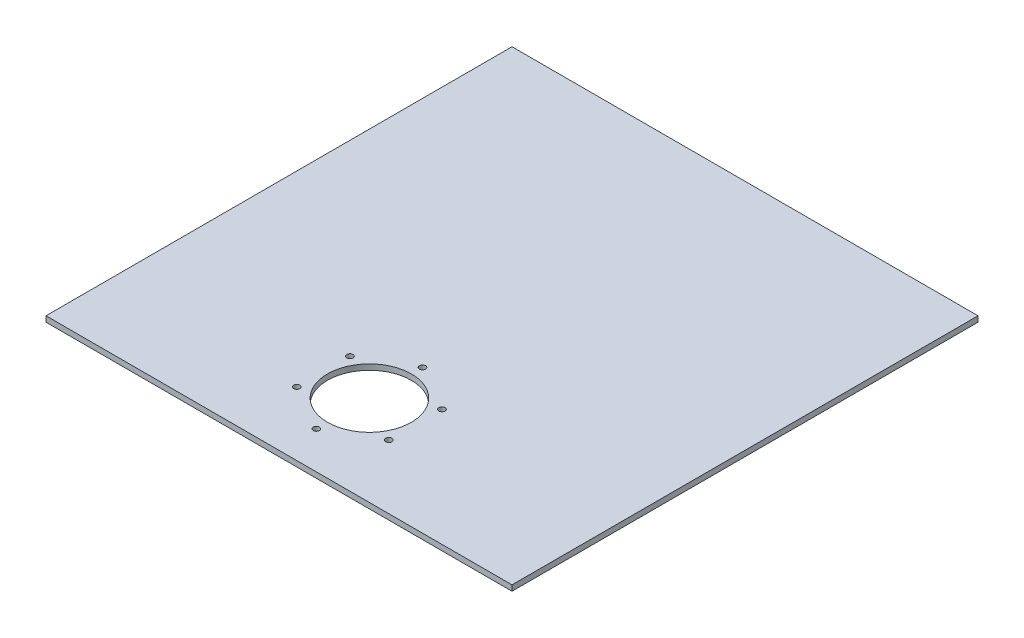
ISO-10303-21;
HEADER;
FILE_DESCRIPTION(('STEP AP214'),'2;1');
FILE_NAME('part.step','',(''),(''),'','','');
FILE_SCHEMA(('AUTOMOTIVE_DESIGN { 1 0 10303 214 1 1 1 1 }'));
ENDSEC;
DATA;
#1=APPLICATION_CONTEXT('core data for automotive mechanical design processes');
#2=APPLICATION_PROTOCOL_DEFINITION('international standard','automotive_design',2000,#1);
#3=PRODUCT_CONTEXT('',#1,'mechanical');
#4=PRODUCT('Part','Part','',(#3));
#5=PRODUCT_RELATED_PRODUCT_CATEGORY('part','',(#4));
#6=PRODUCT_DEFINITION_FORMATION('','',#4);
#7=PRODUCT_DEFINITION_CONTEXT('part definition',#1,'design');
#8=PRODUCT_DEFINITION('design','',#6,#7);
#9=PRODUCT_DEFINITION_SHAPE('','',#8);
#10=(LENGTH_UNIT() NAMED_UNIT(*) SI_UNIT(.MILLI.,.METRE.));
#11=(NAMED_UNIT(*) PLANE_ANGLE_UNIT() SI_UNIT($,.RADIAN.));
#12=(NAMED_UNIT(*) SI_UNIT($,.STERADIAN.) SOLID_ANGLE_UNIT());
#13=UNCERTAINTY_MEASURE_WITH_UNIT(LENGTH_MEASURE(1.E-05),#10,'distance_accuracy_value','');
#14=(GEOMETRIC_REPRESENTATION_CONTEXT(3) GLOBAL_UNCERTAINTY_ASSIGNED_CONTEXT((#13)) GLOBAL_UNIT_ASSIGNED_CONTEXT((#10,
#11,#12)) REPRESENTATION_CONTEXT('',''));
#15=CARTESIAN_POINT('',(0.,0.,0.));
#16=DIRECTION('',(0.,0.,1.));
#17=DIRECTION('',(1.,0.,0.));
#18=AXIS2_PLACEMENT_3D('',#15,#16,#17);
#19=CARTESIAN_POINT('',(0.,3.,0.));
#20=DIRECTION('',(0.,-1.,0.));
#21=DIRECTION('',(0.,0.,-1.));
#22=AXIS2_PLACEMENT_3D('',#19,#20,#21);
#23=PLANE('',#22);
#24=CARTESIAN_POINT('',(0.,3.,76.5));
#25=DIRECTION('',(0.,1.,0.));
#26=DIRECTION('',(0.,0.,1.));
#27=AXIS2_PLACEMENT_3D('',#24,#25,#26);
#28=CIRCLE('',#27,22.5);
#29=CARTESIAN_POINT('',(0.,3.,99.));
#30=VERTEX_POINT('',#29);
#31=EDGE_CURVE('E154',#30,#30,#28,.T.);
#32=ORIENTED_EDGE('',*,*,#31,.F.);
#33=EDGE_LOOP('',(#32));
#34=FACE_BOUND('',#33,.T.);
#35=CARTESIAN_POINT('',(-24.6817240078565,3.,90.7500000000001));
#36=DIRECTION('',(0.,1.,0.));
#37=DIRECTION('',(0.,0.,1.));
#38=AXIS2_PLACEMENT_3D('',#35,#36,#37);
#39=CIRCLE('',#38,1.65000000000001);
#40=CARTESIAN_POINT('',(-24.6817240078565,3.,92.4000000000001));
#41=VERTEX_POINT('',#40);
#42=EDGE_CURVE('E133',#41,#41,#39,.T.);
#43=ORIENTED_EDGE('',*,*,#42,.F.);
#44=EDGE_LOOP('',(#43));
#45=FACE_BOUND('',#44,.T.);
#46=DIRECTION('',(0.,0.,-1.));
#47=VECTOR('',#46,1.);
#48=CARTESIAN_POINT('',(125.,3.,125.));
#49=LINE('',#48,#47);
#50=CARTESIAN_POINT('',(125.,3.,125.));
#51=VERTEX_POINT('',#50);
#52=CARTESIAN_POINT('',(125.,3.,-125.));
#53=VERTEX_POINT('',#52);
#54=EDGE_CURVE('E92',#51,#53,#49,.T.);
#55=ORIENTED_EDGE('',*,*,#54,.T.);
#56=DIRECTION('',(-1.,0.,0.));
#57=VECTOR('',#56,1.);
#58=CARTESIAN_POINT('',(-125.,3.,-125.));
#59=LINE('',#58,#57);
#60=CARTESIAN_POINT('',(-125.,3.,-125.));
#61=VERTEX_POINT('',#60);
#62=EDGE_CURVE('E87',#53,#61,#59,.T.);
#63=ORIENTED_EDGE('',*,*,#62,.T.);
#64=DIRECTION('',(0.,0.,1.));
#65=VECTOR('',#64,1.);
#66=CARTESIAN_POINT('',(-125.,3.,125.));
#67=LINE('',#66,#65);
#68=CARTESIAN_POINT('',(-125.,3.,125.));
#69=VERTEX_POINT('',#68);
#70=EDGE_CURVE('E90',#61,#69,#67,.T.);
#71=ORIENTED_EDGE('',*,*,#70,.T.);
#72=DIRECTION('',(1.,0.,0.));
#73=VECTOR('',#72,1.);
#74=CARTESIAN_POINT('',(-125.,3.,125.));
#75=LINE('',#74,#73);
#76=EDGE_CURVE('E57',#69,#51,#75,.T.);
#77=ORIENTED_EDGE('',*,*,#76,.T.);
#78=EDGE_LOOP('',(#55,#63,#71,#77));
#79=FACE_BOUND('',#78,.T.);
#80=CARTESIAN_POINT('',(0.,3.,48.));
#81=DIRECTION('',(0.,1.,0.));
#82=DIRECTION('',(0.,0.,1.));
#83=AXIS2_PLACEMENT_3D('',#80,#81,#82);
#84=CIRCLE('',#83,1.65000000000001);
#85=CARTESIAN_POINT('',(0.,3.,49.65));
#86=VERTEX_POINT('',#85);
#87=EDGE_CURVE('E121',#86,#86,#84,.T.);
#88=ORIENTED_EDGE('',*,*,#87,.F.);
#89=EDGE_LOOP('',(#88));
#90=FACE_BOUND('',#89,.T.);
#91=CARTESIAN_POINT('',(-24.6817240078566,3.,62.2500000000001));
#92=DIRECTION('',(0.,1.,0.));
#93=DIRECTION('',(0.,0.,1.));
#94=AXIS2_PLACEMENT_3D('',#91,#92,#93);
#95=CIRCLE('',#94,1.65000000000001);
#96=CARTESIAN_POINT('',(-24.6817240078566,3.,63.9000000000001));
#97=VERTEX_POINT('',#96);
#98=EDGE_CURVE('E127',#97,#97,#95,.T.);
#99=ORIENTED_EDGE('',*,*,#98,.F.);
#100=EDGE_LOOP('',(#99));
#101=FACE_BOUND('',#100,.T.);
#102=CARTESIAN_POINT('',(0.,3.,105.));
#103=DIRECTION('',(0.,1.,0.));
#104=DIRECTION('',(0.,0.,1.));
#105=AXIS2_PLACEMENT_3D('',#102,#103,#104);
#106=CIRCLE('',#105,1.65000000000001);
#107=CARTESIAN_POINT('',(0.,3.,106.65));
#108=VERTEX_POINT('',#107);
#109=EDGE_CURVE('E139',#108,#108,#106,.T.);
#110=ORIENTED_EDGE('',*,*,#109,.F.);
#111=EDGE_LOOP('',(#110));
#112=FACE_BOUND('',#111,.T.);
#113=CARTESIAN_POINT('',(24.6817240078566,3.,90.7499999999998));
#114=DIRECTION('',(0.,1.,0.));
#115=DIRECTION('',(0.,0.,1.));
#116=AXIS2_PLACEMENT_3D('',#113,#114,#115);
#117=CIRCLE('',#116,1.65000000000001);
#118=CARTESIAN_POINT('',(24.6817240078566,3.,92.3999999999998));
#119=VERTEX_POINT('',#118);
#120=EDGE_CURVE('E145',#119,#119,#117,.T.);
#121=ORIENTED_EDGE('',*,*,#120,.F.);
#122=EDGE_LOOP('',(#121));
#123=FACE_BOUND('',#122,.T.);
#124=CARTESIAN_POINT('',(24.6817240078563,3.,62.2499999999997));
#125=DIRECTION('',(0.,1.,0.));
#126=DIRECTION('',(0.,0.,1.));
#127=AXIS2_PLACEMENT_3D('',#124,#125,#126);
#128=CIRCLE('',#127,1.65000000000001);
#129=CARTESIAN_POINT('',(24.6817240078563,3.,63.8999999999997));
#130=VERTEX_POINT('',#129);
#131=EDGE_CURVE('E151',#130,#130,#128,.T.);
#132=ORIENTED_EDGE('',*,*,#131,.F.);
#133=EDGE_LOOP('',(#132));
#134=FACE_BOUND('',#133,.T.);
#135=ADVANCED_FACE('F39',(#34,#45,#79,#90,#101,#112,#123,#134),#23,.F.);
#136=CARTESIAN_POINT('',(125.,3.,125.));
#137=DIRECTION('',(-1.,0.,0.));
#138=DIRECTION('',(0.,0.,1.));
#139=AXIS2_PLACEMENT_3D('',#136,#137,#138);
#140=PLANE('',#139);
#141=DIRECTION('',(0.,0.,-1.));
#142=VECTOR('',#141,1.);
#143=CARTESIAN_POINT('',(125.,0.,125.));
#144=LINE('',#143,#142);
#145=CARTESIAN_POINT('',(125.,0.,125.));
#146=VERTEX_POINT('',#145);
#147=CARTESIAN_POINT('',(125.,0.,-125.));
#148=VERTEX_POINT('',#147);
#149=EDGE_CURVE('E105',#146,#148,#144,.T.);
#150=ORIENTED_EDGE('',*,*,#149,.T.);
#151=DIRECTION('',(0.,-1.,0.));
#152=VECTOR('',#151,1.);
#153=CARTESIAN_POINT('',(125.,3.,-125.));
#154=LINE('',#153,#152);
#155=EDGE_CURVE('E11',#53,#148,#154,.T.);
#156=ORIENTED_EDGE('',*,*,#155,.F.);
#157=ORIENTED_EDGE('',*,*,#54,.F.);
#158=DIRECTION('',(0.,-1.,0.));
#159=VECTOR('',#158,1.);
#160=CARTESIAN_POINT('',(125.,3.,125.));
#161=LINE('',#160,#159);
#162=EDGE_CURVE('E101',#51,#146,#161,.T.);
#163=ORIENTED_EDGE('',*,*,#162,.T.);
#164=EDGE_LOOP('',(#150,#156,#157,#163));
#165=FACE_BOUND('',#164,.T.);
#166=ADVANCED_FACE('F41',(#165),#140,.F.);
#167=CARTESIAN_POINT('',(-125.,3.,-125.));
#168=DIRECTION('',(0.,0.,1.));
#169=DIRECTION('',(1.,0.,0.));
#170=AXIS2_PLACEMENT_3D('',#167,#168,#169);
#171=PLANE('',#170);
#172=DIRECTION('',(-1.,0.,0.));
#173=VECTOR('',#172,1.);
#174=CARTESIAN_POINT('',(-125.,0.,-125.));
#175=LINE('',#174,#173);
#176=CARTESIAN_POINT('',(-125.,0.,-125.));
#177=VERTEX_POINT('',#176);
#178=EDGE_CURVE('E96',#148,#177,#175,.T.);
#179=ORIENTED_EDGE('',*,*,#178,.T.);
#180=DIRECTION('',(0.,-1.,0.));
#181=VECTOR('',#180,1.);
#182=CARTESIAN_POINT('',(-125.,3.,-125.));
#183=LINE('',#182,#181);
#184=EDGE_CURVE('E49',#61,#177,#183,.T.);
#185=ORIENTED_EDGE('',*,*,#184,.F.);
#186=ORIENTED_EDGE('',*,*,#62,.F.);
#187=ORIENTED_EDGE('',*,*,#155,.T.);
#188=EDGE_LOOP('',(#179,#185,#186,#187));
#189=FACE_BOUND('',#188,.T.);
#190=ADVANCED_FACE('F95',(#189),#171,.F.);
#191=CARTESIAN_POINT('',(-125.,3.,125.));
#192=DIRECTION('',(1.,0.,0.));
#193=DIRECTION('',(0.,0.,-1.));
#194=AXIS2_PLACEMENT_3D('',#191,#192,#193);
#195=PLANE('',#194);
#196=DIRECTION('',(0.,0.,1.));
#197=VECTOR('',#196,1.);
#198=CARTESIAN_POINT('',(-125.,0.,125.));
#199=LINE('',#198,#197);
#200=CARTESIAN_POINT('',(-125.,0.,125.));
#201=VERTEX_POINT('',#200);
#202=EDGE_CURVE('E74',#177,#201,#199,.T.);
#203=ORIENTED_EDGE('',*,*,#202,.T.);
#204=DIRECTION('',(0.,-1.,0.));
#205=VECTOR('',#204,1.);
#206=CARTESIAN_POINT('',(-125.,3.,125.));
#207=LINE('',#206,#205);
#208=EDGE_CURVE('E97',#69,#201,#207,.T.);
#209=ORIENTED_EDGE('',*,*,#208,.F.);
#210=ORIENTED_EDGE('',*,*,#70,.F.);
#211=ORIENTED_EDGE('',*,*,#184,.T.);
#212=EDGE_LOOP('',(#203,#209,#210,#211));
#213=FACE_BOUND('',#212,.T.);
#214=ADVANCED_FACE('F99',(#213),#195,.F.);
#215=CARTESIAN_POINT('',(-125.,3.,125.));
#216=DIRECTION('',(0.,0.,-1.));
#217=DIRECTION('',(-1.,0.,0.));
#218=AXIS2_PLACEMENT_3D('',#215,#216,#217);
#219=PLANE('',#218);
#220=DIRECTION('',(1.,0.,0.));
#221=VECTOR('',#220,1.);
#222=CARTESIAN_POINT('',(-125.,0.,125.));
#223=LINE('',#222,#221);
#224=EDGE_CURVE('E80',#201,#146,#223,.T.);
#225=ORIENTED_EDGE('',*,*,#224,.T.);
#226=ORIENTED_EDGE('',*,*,#162,.F.);
#227=ORIENTED_EDGE('',*,*,#76,.F.);
#228=ORIENTED_EDGE('',*,*,#208,.T.);
#229=EDGE_LOOP('',(#225,#226,#227,#228));
#230=FACE_BOUND('',#229,.T.);
#231=ADVANCED_FACE('F113',(#230),#219,.F.);
#232=CARTESIAN_POINT('',(0.,0.,0.));
#233=DIRECTION('',(0.,-1.,0.));
#234=DIRECTION('',(0.,0.,-1.));
#235=AXIS2_PLACEMENT_3D('',#232,#233,#234);
#236=PLANE('',#235);
#237=CARTESIAN_POINT('',(0.,0.,76.5));
#238=DIRECTION('',(0.,-1.,0.));
#239=DIRECTION('',(0.,0.,-1.));
#240=AXIS2_PLACEMENT_3D('',#237,#238,#239);
#241=CIRCLE('',#240,22.5);
#242=CARTESIAN_POINT('',(0.,0.,54.));
#243=VERTEX_POINT('',#242);
#244=EDGE_CURVE('E43',#243,#243,#241,.T.);
#245=ORIENTED_EDGE('',*,*,#244,.F.);
#246=EDGE_LOOP('',(#245));
#247=FACE_BOUND('',#246,.T.);
#248=CARTESIAN_POINT('',(24.6817240078563,0.,62.2499999999997));
#249=DIRECTION('',(0.,-1.,0.));
#250=DIRECTION('',(0.,0.,-1.));
#251=AXIS2_PLACEMENT_3D('',#248,#249,#250);
#252=CIRCLE('',#251,1.65000000000001);
#253=CARTESIAN_POINT('',(24.6817240078563,0.,60.5999999999997));
#254=VERTEX_POINT('',#253);
#255=EDGE_CURVE('E148',#254,#254,#252,.T.);
#256=ORIENTED_EDGE('',*,*,#255,.F.);
#257=EDGE_LOOP('',(#256));
#258=FACE_BOUND('',#257,.T.);
#259=CARTESIAN_POINT('',(24.6817240078566,0.,90.7499999999998));
#260=DIRECTION('',(0.,-1.,0.));
#261=DIRECTION('',(0.,0.,-1.));
#262=AXIS2_PLACEMENT_3D('',#259,#260,#261);
#263=CIRCLE('',#262,1.65000000000001);
#264=CARTESIAN_POINT('',(24.6817240078566,0.,89.0999999999998));
#265=VERTEX_POINT('',#264);
#266=EDGE_CURVE('E142',#265,#265,#263,.T.);
#267=ORIENTED_EDGE('',*,*,#266,.F.);
#268=EDGE_LOOP('',(#267));
#269=FACE_BOUND('',#268,.T.);
#270=CARTESIAN_POINT('',(0.,0.,105.));
#271=DIRECTION('',(0.,-1.,0.));
#272=DIRECTION('',(0.,0.,-1.));
#273=AXIS2_PLACEMENT_3D('',#270,#271,#272);
#274=CIRCLE('',#273,1.65000000000001);
#275=CARTESIAN_POINT('',(0.,0.,103.35));
#276=VERTEX_POINT('',#275);
#277=EDGE_CURVE('E136',#276,#276,#274,.T.);
#278=ORIENTED_EDGE('',*,*,#277,.F.);
#279=EDGE_LOOP('',(#278));
#280=FACE_BOUND('',#279,.T.);
#281=CARTESIAN_POINT('',(-24.6817240078565,0.,90.7500000000001));
#282=DIRECTION('',(0.,-1.,0.));
#283=DIRECTION('',(0.,0.,-1.));
#284=AXIS2_PLACEMENT_3D('',#281,#282,#283);
#285=CIRCLE('',#284,1.65000000000001);
#286=CARTESIAN_POINT('',(-24.6817240078565,0.,89.1000000000001));
#287=VERTEX_POINT('',#286);
#288=EDGE_CURVE('E130',#287,#287,#285,.T.);
#289=ORIENTED_EDGE('',*,*,#288,.F.);
#290=EDGE_LOOP('',(#289));
#291=FACE_BOUND('',#290,.T.);
#292=CARTESIAN_POINT('',(-24.6817240078566,0.,62.2500000000001));
#293=DIRECTION('',(0.,-1.,0.));
#294=DIRECTION('',(0.,0.,-1.));
#295=AXIS2_PLACEMENT_3D('',#292,#293,#294);
#296=CIRCLE('',#295,1.65000000000001);
#297=CARTESIAN_POINT('',(-24.6817240078566,0.,60.6000000000001));
#298=VERTEX_POINT('',#297);
#299=EDGE_CURVE('E124',#298,#298,#296,.T.);
#300=ORIENTED_EDGE('',*,*,#299,.F.);
#301=EDGE_LOOP('',(#300));
#302=FACE_BOUND('',#301,.T.);
#303=CARTESIAN_POINT('',(0.,0.,48.));
#304=DIRECTION('',(0.,-1.,0.));
#305=DIRECTION('',(0.,0.,-1.));
#306=AXIS2_PLACEMENT_3D('',#303,#304,#305);
#307=CIRCLE('',#306,1.65000000000001);
#308=CARTESIAN_POINT('',(0.,0.,46.35));
#309=VERTEX_POINT('',#308);
#310=EDGE_CURVE('E108',#309,#309,#307,.T.);
#311=ORIENTED_EDGE('',*,*,#310,.F.);
#312=EDGE_LOOP('',(#311));
#313=FACE_BOUND('',#312,.T.);
#314=ORIENTED_EDGE('',*,*,#149,.F.);
#315=ORIENTED_EDGE('',*,*,#224,.F.);
#316=ORIENTED_EDGE('',*,*,#202,.F.);
#317=ORIENTED_EDGE('',*,*,#178,.F.);
#318=EDGE_LOOP('',(#314,#315,#316,#317));
#319=FACE_BOUND('',#318,.T.);
#320=ADVANCED_FACE('F116',(#247,#258,#269,#280,#291,#302,#313,#319),#236,.T.);
#321=CARTESIAN_POINT('',(0.,3.,48.));
#322=DIRECTION('',(0.,1.,0.));
#323=DIRECTION('',(0.,0.,1.));
#324=AXIS2_PLACEMENT_3D('',#321,#322,#323);
#325=CYLINDRICAL_SURFACE('',#324,1.65000000000001);
#326=ORIENTED_EDGE('',*,*,#87,.T.);
#327=EDGE_LOOP('',(#326));
#328=FACE_BOUND('',#327,.T.);
#329=ORIENTED_EDGE('',*,*,#310,.T.);
#330=EDGE_LOOP('',(#329));
#331=FACE_BOUND('',#330,.T.);
#332=ADVANCED_FACE('F165',(#328,#331),#325,.F.);
#333=CARTESIAN_POINT('',(-24.6817240078566,3.,62.2500000000001));
#334=DIRECTION('',(0.,1.,0.));
#335=DIRECTION('',(0.,0.,1.));
#336=AXIS2_PLACEMENT_3D('',#333,#334,#335);
#337=CYLINDRICAL_SURFACE('',#336,1.65000000000001);
#338=ORIENTED_EDGE('',*,*,#98,.T.);
#339=EDGE_LOOP('',(#338));
#340=FACE_BOUND('',#339,.T.);
#341=ORIENTED_EDGE('',*,*,#299,.T.);
#342=EDGE_LOOP('',(#341));
#343=FACE_BOUND('',#342,.T.);
#344=ADVANCED_FACE('F180',(#340,#343),#337,.F.);
#345=CARTESIAN_POINT('',(-24.6817240078565,3.,90.7500000000001));
#346=DIRECTION('',(0.,1.,0.));
#347=DIRECTION('',(0.,0.,1.));
#348=AXIS2_PLACEMENT_3D('',#345,#346,#347);
#349=CYLINDRICAL_SURFACE('',#348,1.65000000000001);
#350=ORIENTED_EDGE('',*,*,#42,.T.);
#351=EDGE_LOOP('',(#350));
#352=FACE_BOUND('',#351,.T.);
#353=ORIENTED_EDGE('',*,*,#288,.T.);
#354=EDGE_LOOP('',(#353));
#355=FACE_BOUND('',#354,.T.);
#356=ADVANCED_FACE('F187',(#352,#355),#349,.F.);
#357=CARTESIAN_POINT('',(0.,3.,105.));
#358=DIRECTION('',(0.,1.,0.));
#359=DIRECTION('',(0.,0.,1.));
#360=AXIS2_PLACEMENT_3D('',#357,#358,#359);
#361=CYLINDRICAL_SURFACE('',#360,1.65000000000001);
#362=ORIENTED_EDGE('',*,*,#109,.T.);
#363=EDGE_LOOP('',(#362));
#364=FACE_BOUND('',#363,.T.);
#365=ORIENTED_EDGE('',*,*,#277,.T.);
#366=EDGE_LOOP('',(#365));
#367=FACE_BOUND('',#366,.T.);
#368=ADVANCED_FACE('F247',(#364,#367),#361,.F.);
#369=CARTESIAN_POINT('',(24.6817240078566,3.,90.7499999999998));
#370=DIRECTION('',(0.,1.,0.));
#371=DIRECTION('',(0.,0.,1.));
#372=AXIS2_PLACEMENT_3D('',#369,#370,#371);
#373=CYLINDRICAL_SURFACE('',#372,1.65000000000001);
#374=ORIENTED_EDGE('',*,*,#120,.T.);
#375=EDGE_LOOP('',(#374));
#376=FACE_BOUND('',#375,.T.);
#377=ORIENTED_EDGE('',*,*,#266,.T.);
#378=EDGE_LOOP('',(#377));
#379=FACE_BOUND('',#378,.T.);
#380=ADVANCED_FACE('F257',(#376,#379),#373,.F.);
#381=CARTESIAN_POINT('',(24.6817240078563,3.,62.2499999999997));
#382=DIRECTION('',(0.,1.,0.));
#383=DIRECTION('',(0.,0.,1.));
#384=AXIS2_PLACEMENT_3D('',#381,#382,#383);
#385=CYLINDRICAL_SURFACE('',#384,1.65000000000001);
#386=ORIENTED_EDGE('',*,*,#131,.T.);
#387=EDGE_LOOP('',(#386));
#388=FACE_BOUND('',#387,.T.);
#389=ORIENTED_EDGE('',*,*,#255,.T.);
#390=EDGE_LOOP('',(#389));
#391=FACE_BOUND('',#390,.T.);
#392=ADVANCED_FACE('F267',(#388,#391),#385,.F.);
#393=CARTESIAN_POINT('',(0.,-7.,76.5));
#394=DIRECTION('',(0.,1.,0.));
#395=DIRECTION('',(0.,0.,1.));
#396=AXIS2_PLACEMENT_3D('',#393,#394,#395);
#397=CYLINDRICAL_SURFACE('',#396,22.5);
#398=ORIENTED_EDGE('',*,*,#244,.T.);
#399=EDGE_LOOP('',(#398));
#400=FACE_BOUND('',#399,.T.);
#401=ORIENTED_EDGE('',*,*,#31,.T.);
#402=EDGE_LOOP('',(#401));
#403=FACE_BOUND('',#402,.T.);
#404=ADVANCED_FACE('F161',(#400,#403),#397,.F.);
#405=CLOSED_SHELL('',(#135,#166,#190,#214,#231,#320,#332,#344,#356,#368,#380,#392,#404));
#406=MANIFOLD_SOLID_BREP('B2',#405);
#407=ADVANCED_BREP_SHAPE_REPRESENTATION('',(#18,#406),#14);
#408=SHAPE_DEFINITION_REPRESENTATION(#9,#407);
ENDSEC;
END-ISO-10303-21;
